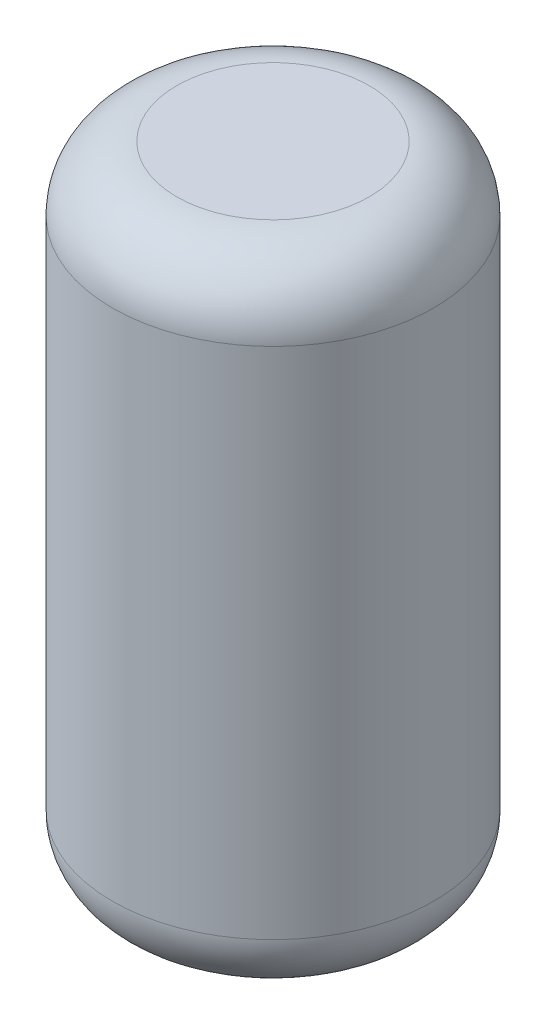
ISO-10303-21;
HEADER;
FILE_DESCRIPTION(('STEP AP214'),'2;1');
FILE_NAME('part.step','',(''),(''),'','','');
FILE_SCHEMA(('AUTOMOTIVE_DESIGN { 1 0 10303 214 1 1 1 1 }'));
ENDSEC;
DATA;
#1=APPLICATION_CONTEXT('core data for automotive mechanical design processes');
#2=APPLICATION_PROTOCOL_DEFINITION('international standard','automotive_design',2000,#1);
#3=PRODUCT_CONTEXT('',#1,'mechanical');
#4=PRODUCT('Part','Part','',(#3));
#5=PRODUCT_RELATED_PRODUCT_CATEGORY('part','',(#4));
#6=PRODUCT_DEFINITION_FORMATION('','',#4);
#7=PRODUCT_DEFINITION_CONTEXT('part definition',#1,'design');
#8=PRODUCT_DEFINITION('design','',#6,#7);
#9=PRODUCT_DEFINITION_SHAPE('','',#8);
#10=(LENGTH_UNIT() NAMED_UNIT(*) SI_UNIT(.MILLI.,.METRE.));
#11=(NAMED_UNIT(*) PLANE_ANGLE_UNIT() SI_UNIT($,.RADIAN.));
#12=(NAMED_UNIT(*) SI_UNIT($,.STERADIAN.) SOLID_ANGLE_UNIT());
#13=UNCERTAINTY_MEASURE_WITH_UNIT(LENGTH_MEASURE(1.E-05),#10,'distance_accuracy_value','');
#14=(GEOMETRIC_REPRESENTATION_CONTEXT(3) GLOBAL_UNCERTAINTY_ASSIGNED_CONTEXT((#13)) GLOBAL_UNIT_ASSIGNED_CONTEXT((#10,
#11,#12)) REPRESENTATION_CONTEXT('',''));
#15=CARTESIAN_POINT('',(0.,0.,0.));
#16=DIRECTION('',(0.,0.,1.));
#17=DIRECTION('',(1.,0.,0.));
#18=AXIS2_PLACEMENT_3D('',#15,#16,#17);
#19=CARTESIAN_POINT('',(0.,5.,0.));
#20=DIRECTION('',(0.,-1.,0.));
#21=DIRECTION('',(0.,0.,-1.));
#22=AXIS2_PLACEMENT_3D('',#19,#20,#21);
#23=CYLINDRICAL_SURFACE('',#22,2.5);
#24=CARTESIAN_POINT('',(0.,-4.,0.));
#25=DIRECTION('',(0.,1.,0.));
#26=DIRECTION('',(0.,0.,1.));
#27=AXIS2_PLACEMENT_3D('',#24,#25,#26);
#28=CIRCLE('',#27,2.5);
#29=CARTESIAN_POINT('',(0.,-4.,2.5));
#30=VERTEX_POINT('',#29);
#31=EDGE_CURVE('E42',#30,#30,#28,.T.);
#32=ORIENTED_EDGE('',*,*,#31,.T.);
#33=EDGE_LOOP('',(#32));
#34=FACE_BOUND('',#33,.T.);
#35=CARTESIAN_POINT('',(0.,4.,0.));
#36=DIRECTION('',(0.,1.,0.));
#37=DIRECTION('',(0.,0.,1.));
#38=AXIS2_PLACEMENT_3D('',#35,#36,#37);
#39=CIRCLE('',#38,2.5);
#40=CARTESIAN_POINT('',(0.,4.,2.5));
#41=VERTEX_POINT('',#40);
#42=EDGE_CURVE('E46',#41,#41,#39,.F.);
#43=ORIENTED_EDGE('',*,*,#42,.T.);
#44=EDGE_LOOP('',(#43));
#45=FACE_BOUND('',#44,.T.);
#46=ADVANCED_FACE('F31',(#34,#45),#23,.T.);
#47=CARTESIAN_POINT('',(0.,5.,0.));
#48=DIRECTION('',(0.,1.,0.));
#49=DIRECTION('',(0.,0.,1.));
#50=AXIS2_PLACEMENT_3D('',#47,#48,#49);
#51=PLANE('',#50);
#52=CARTESIAN_POINT('',(0.,5.,0.));
#53=DIRECTION('',(0.,1.,0.));
#54=DIRECTION('',(0.,0.,1.));
#55=AXIS2_PLACEMENT_3D('',#52,#53,#54);
#56=CIRCLE('',#55,1.5);
#57=CARTESIAN_POINT('',(0.,5.,1.5));
#58=VERTEX_POINT('',#57);
#59=EDGE_CURVE('E10',#58,#58,#56,.T.);
#60=ORIENTED_EDGE('',*,*,#59,.T.);
#61=EDGE_LOOP('',(#60));
#62=FACE_BOUND('',#61,.T.);
#63=ADVANCED_FACE('F62',(#62),#51,.T.);
#64=CARTESIAN_POINT('',(0.,-5.,0.));
#65=DIRECTION('',(0.,1.,0.));
#66=DIRECTION('',(0.,0.,1.));
#67=AXIS2_PLACEMENT_3D('',#64,#65,#66);
#68=PLANE('',#67);
#69=CARTESIAN_POINT('',(0.,-5.,0.));
#70=DIRECTION('',(0.,1.,0.));
#71=DIRECTION('',(0.,0.,1.));
#72=AXIS2_PLACEMENT_3D('',#69,#70,#71);
#73=CIRCLE('',#72,1.5);
#74=CARTESIAN_POINT('',(0.,-5.,1.5));
#75=VERTEX_POINT('',#74);
#76=EDGE_CURVE('E38',#75,#75,#73,.F.);
#77=ORIENTED_EDGE('',*,*,#76,.T.);
#78=EDGE_LOOP('',(#77));
#79=FACE_BOUND('',#78,.T.);
#80=ADVANCED_FACE('F59',(#79),#68,.F.);
#81=CARTESIAN_POINT('',(0.,-4.,0.));
#82=DIRECTION('',(0.,1.,0.));
#83=DIRECTION('',(0.,0.,1.));
#84=AXIS2_PLACEMENT_3D('',#81,#82,#83);
#85=TOROIDAL_SURFACE('',#84,1.5,1.);
#86=ORIENTED_EDGE('',*,*,#76,.F.);
#87=EDGE_LOOP('',(#86));
#88=FACE_BOUND('',#87,.T.);
#89=ORIENTED_EDGE('',*,*,#31,.F.);
#90=EDGE_LOOP('',(#89));
#91=FACE_BOUND('',#90,.T.);
#92=ADVANCED_FACE('F55',(#88,#91),#85,.T.);
#93=CARTESIAN_POINT('',(0.,4.,0.));
#94=DIRECTION('',(0.,1.,0.));
#95=DIRECTION('',(0.,0.,1.));
#96=AXIS2_PLACEMENT_3D('',#93,#94,#95);
#97=TOROIDAL_SURFACE('',#96,1.5,1.);
#98=ORIENTED_EDGE('',*,*,#42,.F.);
#99=EDGE_LOOP('',(#98));
#100=FACE_BOUND('',#99,.T.);
#101=ORIENTED_EDGE('',*,*,#59,.F.);
#102=EDGE_LOOP('',(#101));
#103=FACE_BOUND('',#102,.T.);
#104=ADVANCED_FACE('F33',(#100,#103),#97,.T.);
#105=CLOSED_SHELL('',(#46,#63,#80,#92,#104));
#106=MANIFOLD_SOLID_BREP('B2',#105);
#107=ADVANCED_BREP_SHAPE_REPRESENTATION('',(#18,#106),#14);
#108=SHAPE_DEFINITION_REPRESENTATION(#9,#107);
ENDSEC;
END-ISO-10303-21;
